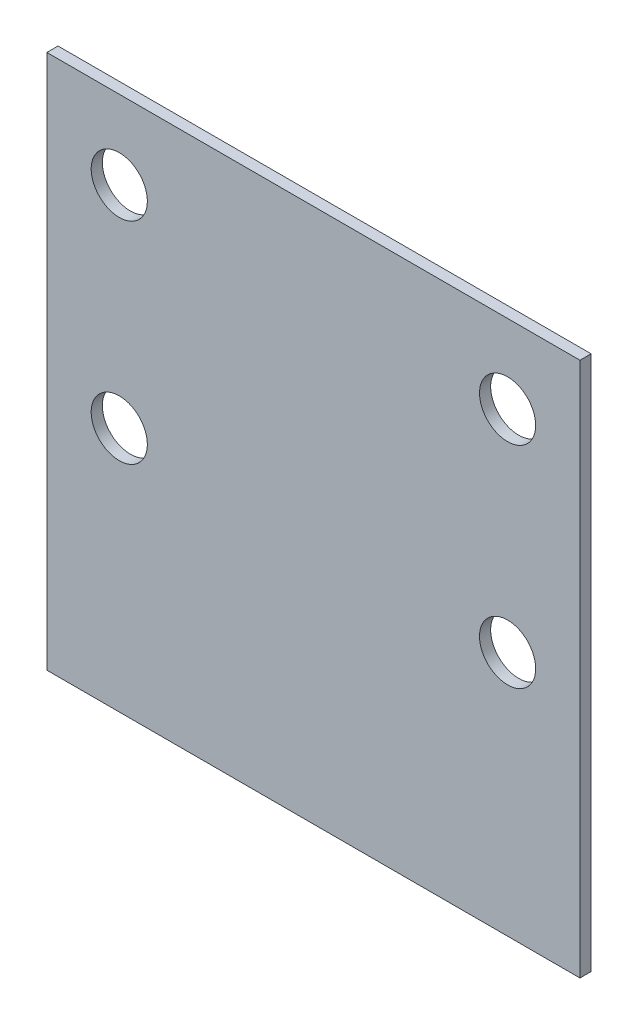
ISO-10303-21;
HEADER;
FILE_DESCRIPTION(('STEP AP214'),'2;1');
FILE_NAME('part.step','',(''),(''),'','','');
FILE_SCHEMA(('AUTOMOTIVE_DESIGN { 1 0 10303 214 1 1 1 1 }'));
ENDSEC;
DATA;
#1=APPLICATION_CONTEXT('core data for automotive mechanical design processes');
#2=APPLICATION_PROTOCOL_DEFINITION('international standard','automotive_design',2000,#1);
#3=PRODUCT_CONTEXT('',#1,'mechanical');
#4=PRODUCT('Part','Part','',(#3));
#5=PRODUCT_RELATED_PRODUCT_CATEGORY('part','',(#4));
#6=PRODUCT_DEFINITION_FORMATION('','',#4);
#7=PRODUCT_DEFINITION_CONTEXT('part definition',#1,'design');
#8=PRODUCT_DEFINITION('design','',#6,#7);
#9=PRODUCT_DEFINITION_SHAPE('','',#8);
#10=(LENGTH_UNIT() NAMED_UNIT(*) SI_UNIT(.MILLI.,.METRE.));
#11=(NAMED_UNIT(*) PLANE_ANGLE_UNIT() SI_UNIT($,.RADIAN.));
#12=(NAMED_UNIT(*) SI_UNIT($,.STERADIAN.) SOLID_ANGLE_UNIT());
#13=UNCERTAINTY_MEASURE_WITH_UNIT(LENGTH_MEASURE(1.E-05),#10,'distance_accuracy_value','');
#14=(GEOMETRIC_REPRESENTATION_CONTEXT(3) GLOBAL_UNCERTAINTY_ASSIGNED_CONTEXT((#13)) GLOBAL_UNIT_ASSIGNED_CONTEXT((#10,
#11,#12)) REPRESENTATION_CONTEXT('',''));
#15=CARTESIAN_POINT('',(0.,0.,0.));
#16=DIRECTION('',(0.,0.,1.));
#17=DIRECTION('',(1.,0.,0.));
#18=AXIS2_PLACEMENT_3D('',#15,#16,#17);
#19=CARTESIAN_POINT('',(0.,0.,1.5875));
#20=DIRECTION('',(0.,0.,1.));
#21=DIRECTION('',(1.,0.,0.));
#22=AXIS2_PLACEMENT_3D('',#19,#20,#21);
#23=PLANE('',#22);
#24=CARTESIAN_POINT('',(172.633956924822,-269.44263943187,1.5875));
#25=DIRECTION('',(0.,0.,1.));
#26=DIRECTION('',(1.,0.,0.));
#27=AXIS2_PLACEMENT_3D('',#24,#25,#26);
#28=CIRCLE('',#27,3.99999999999999);
#29=CARTESIAN_POINT('',(176.633956924822,-269.44263943187,1.5875));
#30=VERTEX_POINT('',#29);
#31=EDGE_CURVE('E124',#30,#30,#28,.T.);
#32=ORIENTED_EDGE('',*,*,#31,.F.);
#33=EDGE_LOOP('',(#32));
#34=FACE_BOUND('',#33,.T.);
#35=CARTESIAN_POINT('',(117.328756924822,-269.44263943187,1.5875));
#36=DIRECTION('',(0.,0.,1.));
#37=DIRECTION('',(1.,0.,0.));
#38=AXIS2_PLACEMENT_3D('',#35,#36,#37);
#39=CIRCLE('',#38,4.00000000000001);
#40=CARTESIAN_POINT('',(121.328756924822,-269.44263943187,1.5875));
#41=VERTEX_POINT('',#40);
#42=EDGE_CURVE('E103',#41,#41,#39,.T.);
#43=ORIENTED_EDGE('',*,*,#42,.F.);
#44=EDGE_LOOP('',(#43));
#45=FACE_BOUND('',#44,.T.);
#46=DIRECTION('',(0.,-1.,0.));
#47=VECTOR('',#46,1.);
#48=CARTESIAN_POINT('',(107.016356924822,-228.24263943187,1.5875));
#49=LINE('',#48,#47);
#50=CARTESIAN_POINT('',(107.016356924822,-228.24263943187,1.5875));
#51=VERTEX_POINT('',#50);
#52=CARTESIAN_POINT('',(107.016356924822,-304.44263943187,1.5875));
#53=VERTEX_POINT('',#52);
#54=EDGE_CURVE('E88',#51,#53,#49,.T.);
#55=ORIENTED_EDGE('',*,*,#54,.T.);
#56=DIRECTION('',(1.,0.,0.));
#57=VECTOR('',#56,1.);
#58=CARTESIAN_POINT('',(107.016356924822,-304.44263943187,1.5875));
#59=LINE('',#58,#57);
#60=CARTESIAN_POINT('',(182.946356924822,-304.44263943187,1.5875));
#61=VERTEX_POINT('',#60);
#62=EDGE_CURVE('E83',#53,#61,#59,.T.);
#63=ORIENTED_EDGE('',*,*,#62,.T.);
#64=DIRECTION('',(0.,1.,0.));
#65=VECTOR('',#64,1.);
#66=CARTESIAN_POINT('',(182.946356924822,-304.44263943187,1.5875));
#67=LINE('',#66,#65);
#68=CARTESIAN_POINT('',(182.946356924822,-228.24263943187,1.5875));
#69=VERTEX_POINT('',#68);
#70=EDGE_CURVE('E86',#61,#69,#67,.T.);
#71=ORIENTED_EDGE('',*,*,#70,.T.);
#72=DIRECTION('',(-1.,0.,0.));
#73=VECTOR('',#72,1.);
#74=CARTESIAN_POINT('',(182.946356924822,-228.24263943187,1.5875));
#75=LINE('',#74,#73);
#76=EDGE_CURVE('E53',#69,#51,#75,.T.);
#77=ORIENTED_EDGE('',*,*,#76,.T.);
#78=EDGE_LOOP('',(#55,#63,#71,#77));
#79=FACE_BOUND('',#78,.T.);
#80=CARTESIAN_POINT('',(117.328756924822,-239.44263943187,1.5875));
#81=DIRECTION('',(0.,0.,1.));
#82=DIRECTION('',(1.,0.,0.));
#83=AXIS2_PLACEMENT_3D('',#80,#81,#82);
#84=CIRCLE('',#83,4.00000000000001);
#85=CARTESIAN_POINT('',(121.328756924822,-239.44263943187,1.5875));
#86=VERTEX_POINT('',#85);
#87=EDGE_CURVE('E118',#86,#86,#84,.T.);
#88=ORIENTED_EDGE('',*,*,#87,.F.);
#89=EDGE_LOOP('',(#88));
#90=FACE_BOUND('',#89,.T.);
#91=CARTESIAN_POINT('',(172.633956924822,-239.44263943187,1.5875));
#92=DIRECTION('',(0.,0.,1.));
#93=DIRECTION('',(1.,0.,0.));
#94=AXIS2_PLACEMENT_3D('',#91,#92,#93);
#95=CIRCLE('',#94,3.99999999999999);
#96=CARTESIAN_POINT('',(176.633956924822,-239.44263943187,1.5875));
#97=VERTEX_POINT('',#96);
#98=EDGE_CURVE('E130',#97,#97,#95,.T.);
#99=ORIENTED_EDGE('',*,*,#98,.F.);
#100=EDGE_LOOP('',(#99));
#101=FACE_BOUND('',#100,.T.);
#102=ADVANCED_FACE('F36',(#34,#45,#79,#90,#101),#23,.T.);
#103=CARTESIAN_POINT('',(0.,0.,0.));
#104=DIRECTION('',(0.,0.,1.));
#105=DIRECTION('',(1.,0.,0.));
#106=AXIS2_PLACEMENT_3D('',#103,#104,#105);
#107=PLANE('',#106);
#108=DIRECTION('',(0.,-1.,0.));
#109=VECTOR('',#108,1.);
#110=CARTESIAN_POINT('',(107.016356924822,-228.24263943187,0.));
#111=LINE('',#110,#109);
#112=CARTESIAN_POINT('',(107.016356924822,-228.24263943187,0.));
#113=VERTEX_POINT('',#112);
#114=CARTESIAN_POINT('',(107.016356924822,-304.44263943187,0.));
#115=VERTEX_POINT('',#114);
#116=EDGE_CURVE('E100',#113,#115,#111,.T.);
#117=ORIENTED_EDGE('',*,*,#116,.F.);
#118=DIRECTION('',(-1.,0.,0.));
#119=VECTOR('',#118,1.);
#120=CARTESIAN_POINT('',(182.946356924822,-228.24263943187,0.));
#121=LINE('',#120,#119);
#122=CARTESIAN_POINT('',(182.946356924822,-228.24263943187,0.));
#123=VERTEX_POINT('',#122);
#124=EDGE_CURVE('E76',#123,#113,#121,.T.);
#125=ORIENTED_EDGE('',*,*,#124,.F.);
#126=DIRECTION('',(0.,1.,0.));
#127=VECTOR('',#126,1.);
#128=CARTESIAN_POINT('',(182.946356924822,-304.44263943187,0.));
#129=LINE('',#128,#127);
#130=CARTESIAN_POINT('',(182.946356924822,-304.44263943187,0.));
#131=VERTEX_POINT('',#130);
#132=EDGE_CURVE('E70',#131,#123,#129,.T.);
#133=ORIENTED_EDGE('',*,*,#132,.F.);
#134=DIRECTION('',(1.,0.,0.));
#135=VECTOR('',#134,1.);
#136=CARTESIAN_POINT('',(107.016356924822,-304.44263943187,0.));
#137=LINE('',#136,#135);
#138=EDGE_CURVE('E92',#115,#131,#137,.T.);
#139=ORIENTED_EDGE('',*,*,#138,.F.);
#140=EDGE_LOOP('',(#117,#125,#133,#139));
#141=FACE_BOUND('',#140,.T.);
#142=CARTESIAN_POINT('',(117.328756924822,-269.44263943187,0.));
#143=DIRECTION('',(0.,0.,1.));
#144=DIRECTION('',(1.,0.,0.));
#145=AXIS2_PLACEMENT_3D('',#142,#143,#144);
#146=CIRCLE('',#145,4.00000000000001);
#147=CARTESIAN_POINT('',(121.328756924822,-269.44263943187,0.));
#148=VERTEX_POINT('',#147);
#149=EDGE_CURVE('E115',#148,#148,#146,.T.);
#150=ORIENTED_EDGE('',*,*,#149,.T.);
#151=EDGE_LOOP('',(#150));
#152=FACE_BOUND('',#151,.T.);
#153=CARTESIAN_POINT('',(117.328756924822,-239.44263943187,0.));
#154=DIRECTION('',(0.,0.,1.));
#155=DIRECTION('',(1.,0.,0.));
#156=AXIS2_PLACEMENT_3D('',#153,#154,#155);
#157=CIRCLE('',#156,4.00000000000001);
#158=CARTESIAN_POINT('',(121.328756924822,-239.44263943187,0.));
#159=VERTEX_POINT('',#158);
#160=EDGE_CURVE('E121',#159,#159,#157,.T.);
#161=ORIENTED_EDGE('',*,*,#160,.T.);
#162=EDGE_LOOP('',(#161));
#163=FACE_BOUND('',#162,.T.);
#164=CARTESIAN_POINT('',(172.633956924822,-269.44263943187,0.));
#165=DIRECTION('',(0.,0.,1.));
#166=DIRECTION('',(1.,0.,0.));
#167=AXIS2_PLACEMENT_3D('',#164,#165,#166);
#168=CIRCLE('',#167,3.99999999999999);
#169=CARTESIAN_POINT('',(176.633956924822,-269.44263943187,0.));
#170=VERTEX_POINT('',#169);
#171=EDGE_CURVE('E127',#170,#170,#168,.T.);
#172=ORIENTED_EDGE('',*,*,#171,.T.);
#173=EDGE_LOOP('',(#172));
#174=FACE_BOUND('',#173,.T.);
#175=CARTESIAN_POINT('',(172.633956924822,-239.44263943187,0.));
#176=DIRECTION('',(0.,0.,1.));
#177=DIRECTION('',(1.,0.,0.));
#178=AXIS2_PLACEMENT_3D('',#175,#176,#177);
#179=CIRCLE('',#178,3.99999999999999);
#180=CARTESIAN_POINT('',(176.633956924822,-239.44263943187,0.));
#181=VERTEX_POINT('',#180);
#182=EDGE_CURVE('E133',#181,#181,#179,.T.);
#183=ORIENTED_EDGE('',*,*,#182,.T.);
#184=EDGE_LOOP('',(#183));
#185=FACE_BOUND('',#184,.T.);
#186=ADVANCED_FACE('F111',(#141,#152,#163,#174,#185),#107,.F.);
#187=CARTESIAN_POINT('',(107.016356924822,-228.24263943187,1.5875));
#188=DIRECTION('',(1.,0.,0.));
#189=DIRECTION('',(0.,0.,-1.));
#190=AXIS2_PLACEMENT_3D('',#187,#188,#189);
#191=PLANE('',#190);
#192=ORIENTED_EDGE('',*,*,#116,.T.);
#193=DIRECTION('',(0.,0.,-1.));
#194=VECTOR('',#193,1.);
#195=CARTESIAN_POINT('',(107.016356924822,-304.44263943187,1.5875));
#196=LINE('',#195,#194);
#197=EDGE_CURVE('E11',#53,#115,#196,.T.);
#198=ORIENTED_EDGE('',*,*,#197,.F.);
#199=ORIENTED_EDGE('',*,*,#54,.F.);
#200=DIRECTION('',(0.,0.,-1.));
#201=VECTOR('',#200,1.);
#202=CARTESIAN_POINT('',(107.016356924822,-228.24263943187,1.5875));
#203=LINE('',#202,#201);
#204=EDGE_CURVE('E96',#51,#113,#203,.T.);
#205=ORIENTED_EDGE('',*,*,#204,.T.);
#206=EDGE_LOOP('',(#192,#198,#199,#205));
#207=FACE_BOUND('',#206,.T.);
#208=ADVANCED_FACE('F38',(#207),#191,.F.);
#209=CARTESIAN_POINT('',(107.016356924822,-304.44263943187,1.5875));
#210=DIRECTION('',(0.,1.,0.));
#211=DIRECTION('',(0.,0.,1.));
#212=AXIS2_PLACEMENT_3D('',#209,#210,#211);
#213=PLANE('',#212);
#214=ORIENTED_EDGE('',*,*,#138,.T.);
#215=DIRECTION('',(0.,0.,-1.));
#216=VECTOR('',#215,1.);
#217=CARTESIAN_POINT('',(182.946356924822,-304.44263943187,1.5875));
#218=LINE('',#217,#216);
#219=EDGE_CURVE('E45',#61,#131,#218,.T.);
#220=ORIENTED_EDGE('',*,*,#219,.F.);
#221=ORIENTED_EDGE('',*,*,#62,.F.);
#222=ORIENTED_EDGE('',*,*,#197,.T.);
#223=EDGE_LOOP('',(#214,#220,#221,#222));
#224=FACE_BOUND('',#223,.T.);
#225=ADVANCED_FACE('F91',(#224),#213,.F.);
#226=CARTESIAN_POINT('',(182.946356924822,-304.44263943187,1.5875));
#227=DIRECTION('',(-1.,0.,0.));
#228=DIRECTION('',(0.,0.,1.));
#229=AXIS2_PLACEMENT_3D('',#226,#227,#228);
#230=PLANE('',#229);
#231=ORIENTED_EDGE('',*,*,#132,.T.);
#232=DIRECTION('',(0.,0.,-1.));
#233=VECTOR('',#232,1.);
#234=CARTESIAN_POINT('',(182.946356924822,-228.24263943187,1.5875));
#235=LINE('',#234,#233);
#236=EDGE_CURVE('E93',#69,#123,#235,.T.);
#237=ORIENTED_EDGE('',*,*,#236,.F.);
#238=ORIENTED_EDGE('',*,*,#70,.F.);
#239=ORIENTED_EDGE('',*,*,#219,.T.);
#240=EDGE_LOOP('',(#231,#237,#238,#239));
#241=FACE_BOUND('',#240,.T.);
#242=ADVANCED_FACE('F94',(#241),#230,.F.);
#243=CARTESIAN_POINT('',(182.946356924822,-228.24263943187,1.5875));
#244=DIRECTION('',(0.,-1.,0.));
#245=DIRECTION('',(0.,0.,-1.));
#246=AXIS2_PLACEMENT_3D('',#243,#244,#245);
#247=PLANE('',#246);
#248=ORIENTED_EDGE('',*,*,#124,.T.);
#249=ORIENTED_EDGE('',*,*,#204,.F.);
#250=ORIENTED_EDGE('',*,*,#76,.F.);
#251=ORIENTED_EDGE('',*,*,#236,.T.);
#252=EDGE_LOOP('',(#248,#249,#250,#251));
#253=FACE_BOUND('',#252,.T.);
#254=ADVANCED_FACE('F108',(#253),#247,.F.);
#255=CARTESIAN_POINT('',(117.328756924822,-269.44263943187,1.5875));
#256=DIRECTION('',(0.,0.,-1.));
#257=DIRECTION('',(-1.,0.,0.));
#258=AXIS2_PLACEMENT_3D('',#255,#256,#257);
#259=CYLINDRICAL_SURFACE('',#258,4.00000000000001);
#260=ORIENTED_EDGE('',*,*,#42,.T.);
#261=EDGE_LOOP('',(#260));
#262=FACE_BOUND('',#261,.T.);
#263=ORIENTED_EDGE('',*,*,#149,.F.);
#264=EDGE_LOOP('',(#263));
#265=FACE_BOUND('',#264,.T.);
#266=ADVANCED_FACE('F152',(#262,#265),#259,.F.);
#267=CARTESIAN_POINT('',(117.328756924822,-239.44263943187,1.5875));
#268=DIRECTION('',(0.,0.,-1.));
#269=DIRECTION('',(-1.,0.,0.));
#270=AXIS2_PLACEMENT_3D('',#267,#268,#269);
#271=CYLINDRICAL_SURFACE('',#270,4.00000000000001);
#272=ORIENTED_EDGE('',*,*,#87,.T.);
#273=EDGE_LOOP('',(#272));
#274=FACE_BOUND('',#273,.T.);
#275=ORIENTED_EDGE('',*,*,#160,.F.);
#276=EDGE_LOOP('',(#275));
#277=FACE_BOUND('',#276,.T.);
#278=ADVANCED_FACE('F206',(#274,#277),#271,.F.);
#279=CARTESIAN_POINT('',(172.633956924822,-269.44263943187,1.5875));
#280=DIRECTION('',(0.,0.,-1.));
#281=DIRECTION('',(-1.,0.,0.));
#282=AXIS2_PLACEMENT_3D('',#279,#280,#281);
#283=CYLINDRICAL_SURFACE('',#282,3.99999999999999);
#284=ORIENTED_EDGE('',*,*,#31,.T.);
#285=EDGE_LOOP('',(#284));
#286=FACE_BOUND('',#285,.T.);
#287=ORIENTED_EDGE('',*,*,#171,.F.);
#288=EDGE_LOOP('',(#287));
#289=FACE_BOUND('',#288,.T.);
#290=ADVANCED_FACE('F215',(#286,#289),#283,.F.);
#291=CARTESIAN_POINT('',(172.633956924822,-239.44263943187,1.5875));
#292=DIRECTION('',(0.,0.,-1.));
#293=DIRECTION('',(-1.,0.,0.));
#294=AXIS2_PLACEMENT_3D('',#291,#292,#293);
#295=CYLINDRICAL_SURFACE('',#294,3.99999999999999);
#296=ORIENTED_EDGE('',*,*,#98,.T.);
#297=EDGE_LOOP('',(#296));
#298=FACE_BOUND('',#297,.T.);
#299=ORIENTED_EDGE('',*,*,#182,.F.);
#300=EDGE_LOOP('',(#299));
#301=FACE_BOUND('',#300,.T.);
#302=ADVANCED_FACE('F139',(#298,#301),#295,.F.);
#303=CLOSED_SHELL('',(#102,#186,#208,#225,#242,#254,#266,#278,#290,#302));
#304=MANIFOLD_SOLID_BREP('B2',#303);
#305=ADVANCED_BREP_SHAPE_REPRESENTATION('',(#18,#304),#14);
#306=SHAPE_DEFINITION_REPRESENTATION(#9,#305);
ENDSEC;
END-ISO-10303-21;
